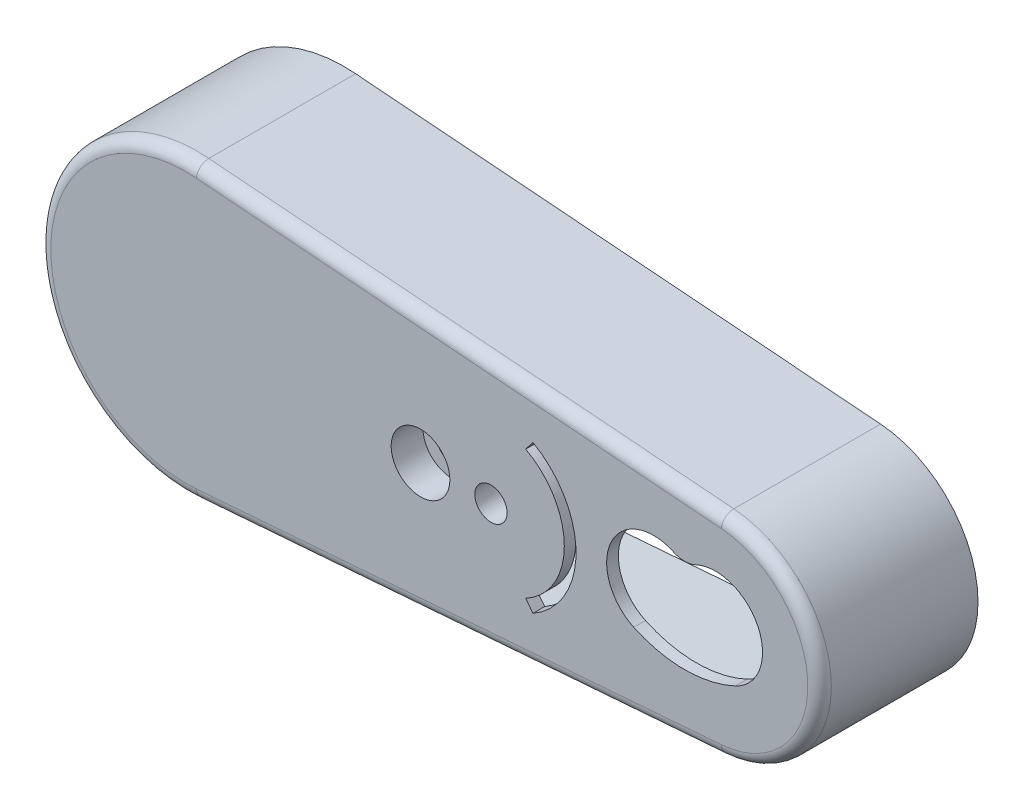
ISO-10303-21;
HEADER;
FILE_DESCRIPTION(('STEP AP214'),'2;1');
FILE_NAME('part.step','',(''),(''),'','','');
FILE_SCHEMA(('AUTOMOTIVE_DESIGN { 1 0 10303 214 1 1 1 1 }'));
ENDSEC;
DATA;
#1=APPLICATION_CONTEXT('core data for automotive mechanical design processes');
#2=APPLICATION_PROTOCOL_DEFINITION('international standard','automotive_design',2000,#1);
#3=PRODUCT_CONTEXT('',#1,'mechanical');
#4=PRODUCT('Part','Part','',(#3));
#5=PRODUCT_RELATED_PRODUCT_CATEGORY('part','',(#4));
#6=PRODUCT_DEFINITION_FORMATION('','',#4);
#7=PRODUCT_DEFINITION_CONTEXT('part definition',#1,'design');
#8=PRODUCT_DEFINITION('design','',#6,#7);
#9=PRODUCT_DEFINITION_SHAPE('','',#8);
#10=(LENGTH_UNIT() NAMED_UNIT(*) SI_UNIT(.MILLI.,.METRE.));
#11=(NAMED_UNIT(*) PLANE_ANGLE_UNIT() SI_UNIT($,.RADIAN.));
#12=(NAMED_UNIT(*) SI_UNIT($,.STERADIAN.) SOLID_ANGLE_UNIT());
#13=UNCERTAINTY_MEASURE_WITH_UNIT(LENGTH_MEASURE(1.E-05),#10,'distance_accuracy_value','');
#14=(GEOMETRIC_REPRESENTATION_CONTEXT(3) GLOBAL_UNCERTAINTY_ASSIGNED_CONTEXT((#13)) GLOBAL_UNIT_ASSIGNED_CONTEXT((#10,
#11,#12)) REPRESENTATION_CONTEXT('',''));
#15=CARTESIAN_POINT('',(0.,0.,0.));
#16=DIRECTION('',(0.,0.,1.));
#17=DIRECTION('',(1.,0.,0.));
#18=AXIS2_PLACEMENT_3D('',#15,#16,#17);
#19=CARTESIAN_POINT('',(0.,0.,25.));
#20=DIRECTION('',(0.,0.,1.));
#21=DIRECTION('',(1.,0.,0.));
#22=AXIS2_PLACEMENT_3D('',#19,#20,#21);
#23=PLANE('',#22);
#24=CARTESIAN_POINT('',(52.,0.,25.));
#25=DIRECTION('',(0.,0.,1.));
#26=DIRECTION('',(1.,0.,0.));
#27=AXIS2_PLACEMENT_3D('',#24,#25,#26);
#28=CIRCLE('',#27,12.5);
#29=CARTESIAN_POINT('',(57.9247778725247,-11.0066801153318,25.));
#30=VERTEX_POINT('',#29);
#31=CARTESIAN_POINT('',(57.9247778725249,11.0066801153318,25.));
#32=VERTEX_POINT('',#31);
#33=EDGE_CURVE('E243',#30,#32,#28,.T.);
#34=ORIENTED_EDGE('',*,*,#33,.F.);
#35=DIRECTION('',(-0.608761429008709,0.793353340291244,0.));
#36=VECTOR('',#35,1.);
#37=CARTESIAN_POINT('',(59.1559637337588,-12.6111927683756,25.));
#38=LINE('',#37,#36);
#39=CARTESIAN_POINT('',(59.1559637337588,-12.6111927683756,25.));
#40=VERTEX_POINT('',#39);
#41=EDGE_CURVE('E225',#40,#30,#38,.T.);
#42=ORIENTED_EDGE('',*,*,#41,.F.);
#43=CARTESIAN_POINT('',(52.,0.,25.));
#44=DIRECTION('',(0.,0.,1.));
#45=DIRECTION('',(1.,0.,0.));
#46=AXIS2_PLACEMENT_3D('',#43,#44,#45);
#47=CIRCLE('',#46,14.5);
#48=CARTESIAN_POINT('',(59.155963733759,12.6111927683754,25.));
#49=VERTEX_POINT('',#48);
#50=EDGE_CURVE('E231',#49,#40,#47,.F.);
#51=ORIENTED_EDGE('',*,*,#50,.F.);
#52=DIRECTION('',(0.608761429008719,0.793353340291236,0.));
#53=VECTOR('',#52,1.);
#54=CARTESIAN_POINT('',(57.9247778725249,11.0066801153318,25.));
#55=LINE('',#54,#53);
#56=EDGE_CURVE('E62',#32,#49,#55,.T.);
#57=ORIENTED_EDGE('',*,*,#56,.F.);
#58=EDGE_LOOP('',(#34,#42,#51,#57));
#59=FACE_BOUND('',#58,.T.);
#60=DIRECTION('',(-1.,0.,0.));
#61=VECTOR('',#60,1.);
#62=CARTESIAN_POINT('',(40.,-6.,25.));
#63=LINE('',#62,#61);
#64=CARTESIAN_POINT('',(52.,-6.,25.));
#65=VERTEX_POINT('',#64);
#66=CARTESIAN_POINT('',(40.,-6.,25.));
#67=VERTEX_POINT('',#66);
#68=EDGE_CURVE('E303',#65,#67,#63,.T.);
#69=ORIENTED_EDGE('',*,*,#68,.F.);
#70=CARTESIAN_POINT('',(52.,0.,25.));
#71=DIRECTION('',(0.,0.,1.));
#72=DIRECTION('',(1.,0.,0.));
#73=AXIS2_PLACEMENT_3D('',#70,#71,#72);
#74=CIRCLE('',#73,6.);
#75=CARTESIAN_POINT('',(52.,6.,25.));
#76=VERTEX_POINT('',#75);
#77=EDGE_CURVE('E294',#76,#65,#74,.F.);
#78=ORIENTED_EDGE('',*,*,#77,.F.);
#79=DIRECTION('',(-1.,0.,0.));
#80=VECTOR('',#79,1.);
#81=CARTESIAN_POINT('',(40.,6.,25.));
#82=LINE('',#81,#80);
#83=CARTESIAN_POINT('',(40.,6.,25.));
#84=VERTEX_POINT('',#83);
#85=EDGE_CURVE('E318',#76,#84,#82,.T.);
#86=ORIENTED_EDGE('',*,*,#85,.T.);
#87=CARTESIAN_POINT('',(40.,0.,25.));
#88=DIRECTION('',(0.,0.,1.));
#89=DIRECTION('',(1.,0.,0.));
#90=AXIS2_PLACEMENT_3D('',#87,#88,#89);
#91=CIRCLE('',#90,6.);
#92=EDGE_CURVE('E314',#84,#67,#91,.T.);
#93=ORIENTED_EDGE('',*,*,#92,.T.);
#94=EDGE_LOOP('',(#69,#78,#86,#93));
#95=FACE_BOUND('',#94,.T.);
#96=CARTESIAN_POINT('',(90.,0.,25.));
#97=DIRECTION('',(0.,0.,1.));
#98=DIRECTION('',(1.,0.,0.));
#99=AXIS2_PLACEMENT_3D('',#96,#97,#98);
#100=CIRCLE('',#99,14.5);
#101=CARTESIAN_POINT('',(91.1277777777778,14.4560754454295,25.));
#102=VERTEX_POINT('',#101);
#103=CARTESIAN_POINT('',(91.1277777777778,-14.4560754454295,25.));
#104=VERTEX_POINT('',#103);
#105=EDGE_CURVE('E446',#102,#104,#100,.F.);
#106=ORIENTED_EDGE('',*,*,#105,.T.);
#107=DIRECTION('',(0.996970720374451,0.0777777777777779,0.));
#108=VECTOR('',#107,1.);
#109=CARTESIAN_POINT('',(91.1277777777778,-14.4560754454295,25.));
#110=LINE('',#109,#108);
#111=CARTESIAN_POINT('',(1.67222222222222,-21.4348704880507,25.));
#112=VERTEX_POINT('',#111);
#113=EDGE_CURVE('E386',#112,#104,#110,.T.);
#114=ORIENTED_EDGE('',*,*,#113,.F.);
#115=CARTESIAN_POINT('',(0.,0.,25.));
#116=DIRECTION('',(0.,0.,1.));
#117=DIRECTION('',(1.,0.,0.));
#118=AXIS2_PLACEMENT_3D('',#115,#116,#117);
#119=CIRCLE('',#118,21.5);
#120=CARTESIAN_POINT('',(1.67222222222222,21.4348704880507,25.));
#121=VERTEX_POINT('',#120);
#122=EDGE_CURVE('E449',#112,#121,#119,.F.);
#123=ORIENTED_EDGE('',*,*,#122,.T.);
#124=DIRECTION('',(0.996970720374451,-0.0777777777777779,0.));
#125=VECTOR('',#124,1.);
#126=CARTESIAN_POINT('',(91.1277777777778,14.4560754454295,25.));
#127=LINE('',#126,#125);
#128=EDGE_CURVE('E444',#121,#102,#127,.T.);
#129=ORIENTED_EDGE('',*,*,#128,.T.);
#130=EDGE_LOOP('',(#106,#114,#123,#129));
#131=FACE_BOUND('',#130,.T.);
#132=CARTESIAN_POINT('',(79.7172717282413,1.17115266204186,25.));
#133=DIRECTION('',(0.,0.,1.));
#134=DIRECTION('',(1.,0.,0.));
#135=AXIS2_PLACEMENT_3D('',#132,#133,#134);
#136=CIRCLE('',#135,8.);
#137=CARTESIAN_POINT('',(83.0982178221669,8.42161495833507,25.));
#138=VERTEX_POINT('',#137);
#139=CARTESIAN_POINT('',(76.3363256343157,-6.07930963425135,25.));
#140=VERTEX_POINT('',#139);
#141=EDGE_CURVE('E320',#138,#140,#136,.T.);
#142=ORIENTED_EDGE('',*,*,#141,.T.);
#143=CARTESIAN_POINT('',(85.,12.5,25.));
#144=DIRECTION('',(0.,0.,1.));
#145=DIRECTION('',(1.,0.,0.));
#146=AXIS2_PLACEMENT_3D('',#143,#144,#145);
#147=CIRCLE('',#146,20.5);
#148=CARTESIAN_POINT('',(93.6636743656843,-6.07930963425135,25.));
#149=VERTEX_POINT('',#148);
#150=EDGE_CURVE('E340',#149,#140,#147,.F.);
#151=ORIENTED_EDGE('',*,*,#150,.F.);
#152=CARTESIAN_POINT('',(90.2827282717587,1.17115266204186,25.));
#153=DIRECTION('',(0.,0.,1.));
#154=DIRECTION('',(1.,0.,0.));
#155=AXIS2_PLACEMENT_3D('',#152,#153,#154);
#156=CIRCLE('',#155,8.);
#157=CARTESIAN_POINT('',(86.9017821778331,8.42161495833507,25.));
#158=VERTEX_POINT('',#157);
#159=EDGE_CURVE('E355',#158,#149,#156,.F.);
#160=ORIENTED_EDGE('',*,*,#159,.F.);
#161=CARTESIAN_POINT('',(85.,12.5,25.));
#162=DIRECTION('',(0.,0.,1.));
#163=DIRECTION('',(1.,0.,0.));
#164=AXIS2_PLACEMENT_3D('',#161,#162,#163);
#165=CIRCLE('',#164,4.5);
#166=EDGE_CURVE('E336',#138,#158,#165,.T.);
#167=ORIENTED_EDGE('',*,*,#166,.F.);
#168=EDGE_LOOP('',(#142,#151,#160,#167));
#169=FACE_BOUND('',#168,.T.);
#170=ADVANCED_FACE('F45',(#59,#95,#131,#169),#23,.F.);
#171=CARTESIAN_POINT('',(0.,0.,27.));
#172=DIRECTION('',(0.,0.,1.));
#173=DIRECTION('',(1.,0.,0.));
#174=AXIS2_PLACEMENT_3D('',#171,#172,#173);
#175=PLANE('',#174);
#176=DIRECTION('',(0.608761429008709,-0.793353340291244,0.));
#177=VECTOR('',#176,1.);
#178=CARTESIAN_POINT('',(59.1559637337588,-12.6111927683756,27.));
#179=LINE('',#178,#177);
#180=CARTESIAN_POINT('',(57.9247778725247,-11.0066801153318,27.));
#181=VERTEX_POINT('',#180);
#182=CARTESIAN_POINT('',(59.1559637337588,-12.6111927683756,27.));
#183=VERTEX_POINT('',#182);
#184=EDGE_CURVE('E73',#181,#183,#179,.T.);
#185=ORIENTED_EDGE('',*,*,#184,.F.);
#186=CARTESIAN_POINT('',(52.,0.,27.));
#187=DIRECTION('',(0.,0.,-1.));
#188=DIRECTION('',(1.,0.,0.));
#189=AXIS2_PLACEMENT_3D('',#186,#187,#188);
#190=CIRCLE('',#189,12.5);
#191=CARTESIAN_POINT('',(57.9247778725249,11.0066801153318,27.));
#192=VERTEX_POINT('',#191);
#193=EDGE_CURVE('E256',#192,#181,#190,.T.);
#194=ORIENTED_EDGE('',*,*,#193,.F.);
#195=DIRECTION('',(-0.60876142900872,-0.793353340291236,0.));
#196=VECTOR('',#195,1.);
#197=CARTESIAN_POINT('',(57.9247778725249,11.0066801153318,27.));
#198=LINE('',#197,#196);
#199=CARTESIAN_POINT('',(59.155963733759,12.6111927683754,27.));
#200=VERTEX_POINT('',#199);
#201=EDGE_CURVE('E248',#200,#192,#198,.T.);
#202=ORIENTED_EDGE('',*,*,#201,.F.);
#203=CARTESIAN_POINT('',(52.,0.,27.));
#204=DIRECTION('',(0.,0.,1.));
#205=DIRECTION('',(1.,0.,0.));
#206=AXIS2_PLACEMENT_3D('',#203,#204,#205);
#207=CIRCLE('',#206,14.5);
#208=EDGE_CURVE('E245',#183,#200,#207,.T.);
#209=ORIENTED_EDGE('',*,*,#208,.F.);
#210=EDGE_LOOP('',(#185,#194,#202,#209));
#211=FACE_BOUND('',#210,.T.);
#212=CARTESIAN_POINT('',(52.,0.,27.));
#213=DIRECTION('',(0.,0.,1.));
#214=DIRECTION('',(1.,0.,0.));
#215=AXIS2_PLACEMENT_3D('',#212,#213,#214);
#216=CIRCLE('',#215,2.75);
#217=CARTESIAN_POINT('',(54.75,0.,27.));
#218=VERTEX_POINT('',#217);
#219=EDGE_CURVE('E239',#218,#218,#216,.T.);
#220=ORIENTED_EDGE('',*,*,#219,.F.);
#221=EDGE_LOOP('',(#220));
#222=FACE_BOUND('',#221,.T.);
#223=CARTESIAN_POINT('',(40.,0.,27.));
#224=DIRECTION('',(0.,0.,1.));
#225=DIRECTION('',(1.,0.,0.));
#226=AXIS2_PLACEMENT_3D('',#223,#224,#225);
#227=CIRCLE('',#226,4.99999999999999);
#228=CARTESIAN_POINT('',(45.,0.,27.));
#229=VERTEX_POINT('',#228);
#230=EDGE_CURVE('E273',#229,#229,#227,.T.);
#231=ORIENTED_EDGE('',*,*,#230,.F.);
#232=EDGE_LOOP('',(#231));
#233=FACE_BOUND('',#232,.T.);
#234=CARTESIAN_POINT('',(0.,0.,27.));
#235=DIRECTION('',(0.,0.,1.));
#236=DIRECTION('',(1.,0.,0.));
#237=AXIS2_PLACEMENT_3D('',#234,#235,#236);
#238=CIRCLE('',#237,23.);
#239=CARTESIAN_POINT('',(1.78888888888889,22.9303265686124,27.));
#240=VERTEX_POINT('',#239);
#241=CARTESIAN_POINT('',(1.78888888888889,-22.9303265686124,27.));
#242=VERTEX_POINT('',#241);
#243=EDGE_CURVE('E460',#240,#242,#238,.T.);
#244=ORIENTED_EDGE('',*,*,#243,.T.);
#245=DIRECTION('',(-0.996970720374451,-0.0777777777777778,0.));
#246=VECTOR('',#245,1.);
#247=CARTESIAN_POINT('',(1.78888888888889,-22.9303265686124,27.));
#248=LINE('',#247,#246);
#249=CARTESIAN_POINT('',(91.2444444444445,-15.9515315259912,27.));
#250=VERTEX_POINT('',#249);
#251=EDGE_CURVE('E390',#250,#242,#248,.T.);
#252=ORIENTED_EDGE('',*,*,#251,.F.);
#253=CARTESIAN_POINT('',(90.,0.,27.));
#254=DIRECTION('',(0.,0.,1.));
#255=DIRECTION('',(1.,0.,0.));
#256=AXIS2_PLACEMENT_3D('',#253,#254,#255);
#257=CIRCLE('',#256,16.);
#258=CARTESIAN_POINT('',(91.2444444444445,15.9515315259912,27.));
#259=VERTEX_POINT('',#258);
#260=EDGE_CURVE('E463',#250,#259,#257,.T.);
#261=ORIENTED_EDGE('',*,*,#260,.T.);
#262=DIRECTION('',(-0.996970720374451,0.0777777777777778,0.));
#263=VECTOR('',#262,1.);
#264=CARTESIAN_POINT('',(1.78888888888889,22.9303265686124,27.));
#265=LINE('',#264,#263);
#266=EDGE_CURVE('E458',#259,#240,#265,.T.);
#267=ORIENTED_EDGE('',*,*,#266,.T.);
#268=EDGE_LOOP('',(#244,#252,#261,#267));
#269=FACE_BOUND('',#268,.T.);
#270=CARTESIAN_POINT('',(85.,12.5,27.));
#271=DIRECTION('',(0.,0.,1.));
#272=DIRECTION('',(1.,0.,0.));
#273=AXIS2_PLACEMENT_3D('',#270,#271,#272);
#274=CIRCLE('',#273,20.5);
#275=CARTESIAN_POINT('',(76.3363256343157,-6.07930963425135,27.));
#276=VERTEX_POINT('',#275);
#277=CARTESIAN_POINT('',(93.6636743656843,-6.07930963425135,27.));
#278=VERTEX_POINT('',#277);
#279=EDGE_CURVE('E343',#276,#278,#274,.T.);
#280=ORIENTED_EDGE('',*,*,#279,.F.);
#281=CARTESIAN_POINT('',(79.7172717282413,1.17115266204186,27.));
#282=DIRECTION('',(0.,0.,-1.));
#283=DIRECTION('',(-1.,0.,0.));
#284=AXIS2_PLACEMENT_3D('',#281,#282,#283);
#285=CIRCLE('',#284,8.);
#286=CARTESIAN_POINT('',(83.0982178221669,8.42161495833507,27.));
#287=VERTEX_POINT('',#286);
#288=EDGE_CURVE('E327',#276,#287,#285,.T.);
#289=ORIENTED_EDGE('',*,*,#288,.T.);
#290=CARTESIAN_POINT('',(85.,12.5,27.));
#291=DIRECTION('',(0.,0.,-1.));
#292=DIRECTION('',(1.,0.,0.));
#293=AXIS2_PLACEMENT_3D('',#290,#291,#292);
#294=CIRCLE('',#293,4.5);
#295=CARTESIAN_POINT('',(86.9017821778331,8.42161495833507,27.));
#296=VERTEX_POINT('',#295);
#297=EDGE_CURVE('E350',#296,#287,#294,.T.);
#298=ORIENTED_EDGE('',*,*,#297,.F.);
#299=CARTESIAN_POINT('',(90.2827282717587,1.17115266204186,27.));
#300=DIRECTION('',(0.,0.,1.));
#301=DIRECTION('',(1.,0.,0.));
#302=AXIS2_PLACEMENT_3D('',#299,#300,#301);
#303=CIRCLE('',#302,8.);
#304=EDGE_CURVE('E346',#278,#296,#303,.T.);
#305=ORIENTED_EDGE('',*,*,#304,.F.);
#306=EDGE_LOOP('',(#280,#289,#298,#305));
#307=FACE_BOUND('',#306,.T.);
#308=ADVANCED_FACE('F490',(#211,#222,#233,#269,#307),#175,.T.);
#309=CARTESIAN_POINT('',(90.,0.,25.));
#310=DIRECTION('',(0.,0.,-1.));
#311=DIRECTION('',(-1.,0.,0.));
#312=AXIS2_PLACEMENT_3D('',#309,#310,#311);
#313=CYLINDRICAL_SURFACE('',#312,18.);
#314=DIRECTION('',(0.,0.,-1.));
#315=VECTOR('',#314,1.);
#316=CARTESIAN_POINT('',(91.4,17.9454729667401,25.));
#317=LINE('',#316,#315);
#318=CARTESIAN_POINT('',(91.4,17.9454729667401,25.));
#319=VERTEX_POINT('',#318);
#320=CARTESIAN_POINT('',(91.4,17.9454729667401,0.));
#321=VERTEX_POINT('',#320);
#322=EDGE_CURVE('E442',#319,#321,#317,.T.);
#323=ORIENTED_EDGE('',*,*,#322,.F.);
#324=CARTESIAN_POINT('',(90.,0.,25.));
#325=DIRECTION('',(0.,0.,1.));
#326=DIRECTION('',(1.,0.,0.));
#327=AXIS2_PLACEMENT_3D('',#324,#325,#326);
#328=CIRCLE('',#327,18.);
#329=CARTESIAN_POINT('',(91.4,-17.9454729667401,25.));
#330=VERTEX_POINT('',#329);
#331=EDGE_CURVE('E467',#319,#330,#328,.F.);
#332=ORIENTED_EDGE('',*,*,#331,.T.);
#333=DIRECTION('',(0.,0.,-1.));
#334=VECTOR('',#333,1.);
#335=CARTESIAN_POINT('',(91.4,-17.9454729667401,25.));
#336=LINE('',#335,#334);
#337=CARTESIAN_POINT('',(91.4,-17.9454729667401,0.));
#338=VERTEX_POINT('',#337);
#339=EDGE_CURVE('E382',#330,#338,#336,.T.);
#340=ORIENTED_EDGE('',*,*,#339,.T.);
#341=CARTESIAN_POINT('',(90.,0.,0.));
#342=DIRECTION('',(0.,0.,1.));
#343=DIRECTION('',(1.,0.,0.));
#344=AXIS2_PLACEMENT_3D('',#341,#342,#343);
#345=CIRCLE('',#344,18.);
#346=EDGE_CURVE('E415',#338,#321,#345,.T.);
#347=ORIENTED_EDGE('',*,*,#346,.T.);
#348=EDGE_LOOP('',(#323,#332,#340,#347));
#349=FACE_BOUND('',#348,.T.);
#350=ADVANCED_FACE('F504',(#349),#313,.T.);
#351=CARTESIAN_POINT('',(1.94444444444445,24.9242680093613,25.));
#352=DIRECTION('',(-0.0777777777777778,-0.99697072037445,0.));
#353=DIRECTION('',(0.996970720374451,-0.0777777777777778,0.));
#354=AXIS2_PLACEMENT_3D('',#351,#352,#353);
#355=PLANE('',#354);
#356=DIRECTION('',(0.,0.,-1.));
#357=VECTOR('',#356,1.);
#358=CARTESIAN_POINT('',(1.94444444444444,24.9242680093613,25.));
#359=LINE('',#358,#357);
#360=CARTESIAN_POINT('',(1.94444444444444,24.9242680093613,25.));
#361=VERTEX_POINT('',#360);
#362=CARTESIAN_POINT('',(1.94444444444444,24.9242680093613,0.));
#363=VERTEX_POINT('',#362);
#364=EDGE_CURVE('E440',#361,#363,#359,.T.);
#365=ORIENTED_EDGE('',*,*,#364,.F.);
#366=DIRECTION('',(-0.996970720374451,0.0777777777777778,0.));
#367=VECTOR('',#366,1.);
#368=CARTESIAN_POINT('',(91.4,17.9454729667401,25.));
#369=LINE('',#368,#367);
#370=EDGE_CURVE('E11',#361,#319,#369,.F.);
#371=ORIENTED_EDGE('',*,*,#370,.T.);
#372=ORIENTED_EDGE('',*,*,#322,.T.);
#373=DIRECTION('',(-0.99697072037445,0.0777777777777778,0.));
#374=VECTOR('',#373,1.);
#375=CARTESIAN_POINT('',(1.94444444444445,24.9242680093613,0.));
#376=LINE('',#375,#374);
#377=EDGE_CURVE('E419',#321,#363,#376,.T.);
#378=ORIENTED_EDGE('',*,*,#377,.T.);
#379=EDGE_LOOP('',(#365,#371,#372,#378));
#380=FACE_BOUND('',#379,.T.);
#381=ADVANCED_FACE('F508',(#380),#355,.F.);
#382=CARTESIAN_POINT('',(0.,0.,25.));
#383=DIRECTION('',(0.,0.,-1.));
#384=DIRECTION('',(-1.,0.,0.));
#385=AXIS2_PLACEMENT_3D('',#382,#383,#384);
#386=CYLINDRICAL_SURFACE('',#385,25.);
#387=CARTESIAN_POINT('',(0.,0.,0.));
#388=DIRECTION('',(0.,0.,1.));
#389=DIRECTION('',(1.,0.,0.));
#390=AXIS2_PLACEMENT_3D('',#387,#388,#389);
#391=CIRCLE('',#390,25.);
#392=CARTESIAN_POINT('',(1.94444444444444,-24.9242680093613,0.));
#393=VERTEX_POINT('',#392);
#394=EDGE_CURVE('E423',#363,#393,#391,.T.);
#395=ORIENTED_EDGE('',*,*,#394,.T.);
#396=DIRECTION('',(0.,0.,-1.));
#397=VECTOR('',#396,1.);
#398=CARTESIAN_POINT('',(1.94444444444444,-24.9242680093613,25.));
#399=LINE('',#398,#397);
#400=CARTESIAN_POINT('',(1.94444444444444,-24.9242680093613,25.));
#401=VERTEX_POINT('',#400);
#402=EDGE_CURVE('E379',#401,#393,#399,.T.);
#403=ORIENTED_EDGE('',*,*,#402,.F.);
#404=CARTESIAN_POINT('',(0.,0.,25.));
#405=DIRECTION('',(0.,0.,1.));
#406=DIRECTION('',(1.,0.,0.));
#407=AXIS2_PLACEMENT_3D('',#404,#405,#406);
#408=CIRCLE('',#407,25.);
#409=EDGE_CURVE('E470',#401,#361,#408,.F.);
#410=ORIENTED_EDGE('',*,*,#409,.T.);
#411=ORIENTED_EDGE('',*,*,#364,.T.);
#412=EDGE_LOOP('',(#395,#403,#410,#411));
#413=FACE_BOUND('',#412,.T.);
#414=ADVANCED_FACE('F513',(#413),#386,.T.);
#415=CARTESIAN_POINT('',(0.,0.,25.));
#416=DIRECTION('',(0.,0.,-1.));
#417=DIRECTION('',(-1.,0.,0.));
#418=AXIS2_PLACEMENT_3D('',#415,#416,#417);
#419=CYLINDRICAL_SURFACE('',#418,23.5);
#420=DIRECTION('',(0.,0.,-1.));
#421=VECTOR('',#420,1.);
#422=CARTESIAN_POINT('',(1.82777777777778,23.4288119287996,25.));
#423=LINE('',#422,#421);
#424=CARTESIAN_POINT('',(1.82777777777778,23.4288119287996,23.));
#425=VERTEX_POINT('',#424);
#426=CARTESIAN_POINT('',(1.82777777777778,23.4288119287996,0.));
#427=VERTEX_POINT('',#426);
#428=EDGE_CURVE('E438',#425,#427,#423,.T.);
#429=ORIENTED_EDGE('',*,*,#428,.F.);
#430=CARTESIAN_POINT('',(0.,0.,23.));
#431=DIRECTION('',(0.,0.,1.));
#432=DIRECTION('',(1.,0.,0.));
#433=AXIS2_PLACEMENT_3D('',#430,#431,#432);
#434=CIRCLE('',#433,23.5);
#435=CARTESIAN_POINT('',(1.82777777777778,-23.4288119287996,23.));
#436=VERTEX_POINT('',#435);
#437=EDGE_CURVE('E453',#425,#436,#434,.T.);
#438=ORIENTED_EDGE('',*,*,#437,.T.);
#439=DIRECTION('',(0.,0.,-1.));
#440=VECTOR('',#439,1.);
#441=CARTESIAN_POINT('',(1.82777777777778,-23.4288119287996,25.));
#442=LINE('',#441,#440);
#443=CARTESIAN_POINT('',(1.82777777777778,-23.4288119287996,0.));
#444=VERTEX_POINT('',#443);
#445=EDGE_CURVE('E376',#436,#444,#442,.T.);
#446=ORIENTED_EDGE('',*,*,#445,.T.);
#447=CARTESIAN_POINT('',(0.,0.,0.));
#448=DIRECTION('',(0.,0.,-1.));
#449=DIRECTION('',(1.,0.,0.));
#450=AXIS2_PLACEMENT_3D('',#447,#448,#449);
#451=CIRCLE('',#450,23.5);
#452=EDGE_CURVE('E426',#444,#427,#451,.T.);
#453=ORIENTED_EDGE('',*,*,#452,.T.);
#454=EDGE_LOOP('',(#429,#438,#446,#453));
#455=FACE_BOUND('',#454,.T.);
#456=ADVANCED_FACE('F515',(#455),#419,.F.);
#457=CARTESIAN_POINT('',(1.82777777777778,23.4288119287996,25.));
#458=DIRECTION('',(0.0777777777777779,0.99697072037445,0.));
#459=DIRECTION('',(-0.996970720374451,0.0777777777777779,0.));
#460=AXIS2_PLACEMENT_3D('',#457,#458,#459);
#461=PLANE('',#460);
#462=DIRECTION('',(0.,0.,-1.));
#463=VECTOR('',#462,1.);
#464=CARTESIAN_POINT('',(91.2833333333333,16.4500168861784,25.));
#465=LINE('',#464,#463);
#466=CARTESIAN_POINT('',(91.2833333333333,16.4500168861784,23.));
#467=VERTEX_POINT('',#466);
#468=CARTESIAN_POINT('',(91.2833333333333,16.4500168861784,0.));
#469=VERTEX_POINT('',#468);
#470=EDGE_CURVE('E436',#467,#469,#465,.T.);
#471=ORIENTED_EDGE('',*,*,#470,.F.);
#472=DIRECTION('',(0.996970720374451,-0.0777777777777779,0.));
#473=VECTOR('',#472,1.);
#474=CARTESIAN_POINT('',(1.82777777777778,23.4288119287996,23.));
#475=LINE('',#474,#473);
#476=EDGE_CURVE('E54',#467,#425,#475,.F.);
#477=ORIENTED_EDGE('',*,*,#476,.T.);
#478=ORIENTED_EDGE('',*,*,#428,.T.);
#479=DIRECTION('',(0.99697072037445,-0.0777777777777779,0.));
#480=VECTOR('',#479,1.);
#481=CARTESIAN_POINT('',(1.82777777777778,23.4288119287996,0.));
#482=LINE('',#481,#480);
#483=EDGE_CURVE('E430',#427,#469,#482,.T.);
#484=ORIENTED_EDGE('',*,*,#483,.T.);
#485=EDGE_LOOP('',(#471,#477,#478,#484));
#486=FACE_BOUND('',#485,.T.);
#487=ADVANCED_FACE('F520',(#486),#461,.F.);
#488=CARTESIAN_POINT('',(90.,0.,25.));
#489=DIRECTION('',(0.,0.,-1.));
#490=DIRECTION('',(-1.,0.,0.));
#491=AXIS2_PLACEMENT_3D('',#488,#489,#490);
#492=CYLINDRICAL_SURFACE('',#491,16.5);
#493=CARTESIAN_POINT('',(90.,0.,0.));
#494=DIRECTION('',(0.,0.,-1.));
#495=DIRECTION('',(1.,0.,0.));
#496=AXIS2_PLACEMENT_3D('',#493,#494,#495);
#497=CIRCLE('',#496,16.5);
#498=CARTESIAN_POINT('',(91.2833333333333,-16.4500168861784,0.));
#499=VERTEX_POINT('',#498);
#500=EDGE_CURVE('E433',#469,#499,#497,.T.);
#501=ORIENTED_EDGE('',*,*,#500,.T.);
#502=DIRECTION('',(0.,0.,-1.));
#503=VECTOR('',#502,1.);
#504=CARTESIAN_POINT('',(91.2833333333333,-16.4500168861784,25.));
#505=LINE('',#504,#503);
#506=CARTESIAN_POINT('',(91.2833333333333,-16.4500168861784,23.));
#507=VERTEX_POINT('',#506);
#508=EDGE_CURVE('E372',#507,#499,#505,.T.);
#509=ORIENTED_EDGE('',*,*,#508,.F.);
#510=CARTESIAN_POINT('',(90.,0.,23.));
#511=DIRECTION('',(0.,0.,1.));
#512=DIRECTION('',(1.,0.,0.));
#513=AXIS2_PLACEMENT_3D('',#510,#511,#512);
#514=CIRCLE('',#513,16.5);
#515=EDGE_CURVE('E455',#507,#467,#514,.T.);
#516=ORIENTED_EDGE('',*,*,#515,.T.);
#517=ORIENTED_EDGE('',*,*,#470,.T.);
#518=EDGE_LOOP('',(#501,#509,#516,#517));
#519=FACE_BOUND('',#518,.T.);
#520=ADVANCED_FACE('F536',(#519),#492,.F.);
#521=CARTESIAN_POINT('',(90.,0.,0.));
#522=DIRECTION('',(0.,0.,1.));
#523=DIRECTION('',(1.,0.,0.));
#524=AXIS2_PLACEMENT_3D('',#521,#522,#523);
#525=PLANE('',#524);
#526=ORIENTED_EDGE('',*,*,#452,.F.);
#527=DIRECTION('',(0.99697072037445,0.0777777777777779,0.));
#528=VECTOR('',#527,1.);
#529=CARTESIAN_POINT('',(1.82777777777778,-23.4288119287996,0.));
#530=LINE('',#529,#528);
#531=EDGE_CURVE('E367',#444,#499,#530,.T.);
#532=ORIENTED_EDGE('',*,*,#531,.T.);
#533=ORIENTED_EDGE('',*,*,#500,.F.);
#534=ORIENTED_EDGE('',*,*,#483,.F.);
#535=EDGE_LOOP('',(#526,#532,#533,#534));
#536=FACE_BOUND('',#535,.T.);
#537=ORIENTED_EDGE('',*,*,#346,.F.);
#538=DIRECTION('',(-0.99697072037445,-0.0777777777777778,0.));
#539=VECTOR('',#538,1.);
#540=CARTESIAN_POINT('',(1.94444444444445,-24.9242680093613,0.));
#541=LINE('',#540,#539);
#542=EDGE_CURVE('E363',#338,#393,#541,.T.);
#543=ORIENTED_EDGE('',*,*,#542,.T.);
#544=ORIENTED_EDGE('',*,*,#394,.F.);
#545=ORIENTED_EDGE('',*,*,#377,.F.);
#546=EDGE_LOOP('',(#537,#543,#544,#545));
#547=FACE_BOUND('',#546,.T.);
#548=ADVANCED_FACE('F511',(#536,#547),#525,.F.);
#549=CARTESIAN_POINT('',(90.,0.,23.));
#550=DIRECTION('',(0.,0.,1.));
#551=DIRECTION('',(1.,0.,0.));
#552=AXIS2_PLACEMENT_3D('',#549,#550,#551);
#553=TOROIDAL_SURFACE('',#552,14.5,2.);
#554=ORIENTED_EDGE('',*,*,#515,.F.);
#555=CARTESIAN_POINT('',(91.1277777777778,-14.4560754454295,23.));
#556=DIRECTION('',(-0.99697072037445,-0.0777777777777807,0.));
#557=DIRECTION('',(0.0777777777777807,-0.99697072037445,0.));
#558=AXIS2_PLACEMENT_3D('',#555,#556,#557);
#559=CIRCLE('',#558,2.);
#560=EDGE_CURVE('E368',#507,#104,#559,.T.);
#561=ORIENTED_EDGE('',*,*,#560,.T.);
#562=ORIENTED_EDGE('',*,*,#105,.F.);
#563=CARTESIAN_POINT('',(91.1277777777778,14.4560754454295,23.));
#564=DIRECTION('',(0.99697072037445,-0.0777777777777807,0.));
#565=DIRECTION('',(0.0777777777777807,0.99697072037445,0.));
#566=AXIS2_PLACEMENT_3D('',#563,#564,#565);
#567=CIRCLE('',#566,2.);
#568=EDGE_CURVE('E420',#467,#102,#567,.T.);
#569=ORIENTED_EDGE('',*,*,#568,.F.);
#570=EDGE_LOOP('',(#554,#561,#562,#569));
#571=FACE_BOUND('',#570,.T.);
#572=ADVANCED_FACE('F535',(#571),#553,.F.);
#573=CARTESIAN_POINT('',(1.67222222222222,21.4348704880507,23.));
#574=DIRECTION('',(-0.996970720374451,0.0777777777777779,0.));
#575=DIRECTION('',(-0.0777777777777779,-0.996970720374451,0.));
#576=AXIS2_PLACEMENT_3D('',#573,#574,#575);
#577=CYLINDRICAL_SURFACE('',#576,2.);
#578=ORIENTED_EDGE('',*,*,#568,.T.);
#579=ORIENTED_EDGE('',*,*,#128,.F.);
#580=CARTESIAN_POINT('',(1.67222222222222,21.4348704880507,23.));
#581=DIRECTION('',(0.99697072037445,-0.0777777777777778,0.));
#582=DIRECTION('',(0.0777777777777778,0.99697072037445,0.));
#583=AXIS2_PLACEMENT_3D('',#580,#581,#582);
#584=CIRCLE('',#583,2.);
#585=EDGE_CURVE('E473',#425,#121,#584,.T.);
#586=ORIENTED_EDGE('',*,*,#585,.F.);
#587=ORIENTED_EDGE('',*,*,#476,.F.);
#588=EDGE_LOOP('',(#578,#579,#586,#587));
#589=FACE_BOUND('',#588,.T.);
#590=ADVANCED_FACE('F559',(#589),#577,.F.);
#591=CARTESIAN_POINT('',(0.,0.,23.));
#592=DIRECTION('',(0.,0.,1.));
#593=DIRECTION('',(1.,0.,0.));
#594=AXIS2_PLACEMENT_3D('',#591,#592,#593);
#595=TOROIDAL_SURFACE('',#594,21.5,2.);
#596=ORIENTED_EDGE('',*,*,#122,.F.);
#597=CARTESIAN_POINT('',(1.67222222222222,-21.4348704880507,23.));
#598=DIRECTION('',(-0.99697072037445,-0.0777777777777778,0.));
#599=DIRECTION('',(0.0777777777777778,-0.99697072037445,0.));
#600=AXIS2_PLACEMENT_3D('',#597,#598,#599);
#601=CIRCLE('',#600,2.);
#602=EDGE_CURVE('E403',#436,#112,#601,.T.);
#603=ORIENTED_EDGE('',*,*,#602,.F.);
#604=ORIENTED_EDGE('',*,*,#437,.F.);
#605=ORIENTED_EDGE('',*,*,#585,.T.);
#606=EDGE_LOOP('',(#596,#603,#604,#605));
#607=FACE_BOUND('',#606,.T.);
#608=ADVANCED_FACE('F562',(#607),#595,.F.);
#609=CARTESIAN_POINT('',(0.,0.,25.));
#610=DIRECTION('',(0.,0.,1.));
#611=DIRECTION('',(1.,0.,0.));
#612=AXIS2_PLACEMENT_3D('',#609,#610,#611);
#613=TOROIDAL_SURFACE('',#612,23.,2.);
#614=ORIENTED_EDGE('',*,*,#409,.F.);
#615=CARTESIAN_POINT('',(1.78888888888889,-22.9303265686124,25.));
#616=DIRECTION('',(-0.99697072037445,-0.0777777777777777,0.));
#617=DIRECTION('',(0.0777777777777777,-0.99697072037445,0.));
#618=AXIS2_PLACEMENT_3D('',#615,#616,#617);
#619=CIRCLE('',#618,2.);
#620=EDGE_CURVE('E406',#401,#242,#619,.T.);
#621=ORIENTED_EDGE('',*,*,#620,.T.);
#622=ORIENTED_EDGE('',*,*,#243,.F.);
#623=CARTESIAN_POINT('',(1.78888888888889,22.9303265686124,25.));
#624=DIRECTION('',(0.99697072037445,-0.0777777777777777,0.));
#625=DIRECTION('',(0.0777777777777777,0.99697072037445,0.));
#626=AXIS2_PLACEMENT_3D('',#623,#624,#625);
#627=CIRCLE('',#626,2.);
#628=EDGE_CURVE('E49',#361,#240,#627,.T.);
#629=ORIENTED_EDGE('',*,*,#628,.F.);
#630=EDGE_LOOP('',(#614,#621,#622,#629));
#631=FACE_BOUND('',#630,.T.);
#632=ADVANCED_FACE('F47',(#631),#613,.T.);
#633=CARTESIAN_POINT('',(1.78888888888889,22.9303265686124,25.));
#634=DIRECTION('',(0.996970720374451,-0.0777777777777778,0.));
#635=DIRECTION('',(0.0777777777777778,0.996970720374451,0.));
#636=AXIS2_PLACEMENT_3D('',#633,#634,#635);
#637=CYLINDRICAL_SURFACE('',#636,2.);
#638=ORIENTED_EDGE('',*,*,#628,.T.);
#639=ORIENTED_EDGE('',*,*,#266,.F.);
#640=CARTESIAN_POINT('',(91.2444444444445,15.9515315259912,25.));
#641=DIRECTION('',(0.99697072037445,-0.0777777777777807,0.));
#642=DIRECTION('',(0.0777777777777807,0.99697072037445,0.));
#643=AXIS2_PLACEMENT_3D('',#640,#641,#642);
#644=CIRCLE('',#643,2.);
#645=EDGE_CURVE('E402',#319,#259,#644,.T.);
#646=ORIENTED_EDGE('',*,*,#645,.F.);
#647=ORIENTED_EDGE('',*,*,#370,.F.);
#648=EDGE_LOOP('',(#638,#639,#646,#647));
#649=FACE_BOUND('',#648,.T.);
#650=ADVANCED_FACE('F484',(#649),#637,.T.);
#651=CARTESIAN_POINT('',(90.,0.,25.));
#652=DIRECTION('',(0.,0.,1.));
#653=DIRECTION('',(1.,0.,0.));
#654=AXIS2_PLACEMENT_3D('',#651,#652,#653);
#655=TOROIDAL_SURFACE('',#654,16.,2.);
#656=ORIENTED_EDGE('',*,*,#260,.F.);
#657=CARTESIAN_POINT('',(91.2444444444445,-15.9515315259912,25.));
#658=DIRECTION('',(-0.99697072037445,-0.0777777777777807,0.));
#659=DIRECTION('',(0.0777777777777807,-0.99697072037445,0.));
#660=AXIS2_PLACEMENT_3D('',#657,#658,#659);
#661=CIRCLE('',#660,2.);
#662=EDGE_CURVE('E362',#330,#250,#661,.T.);
#663=ORIENTED_EDGE('',*,*,#662,.F.);
#664=ORIENTED_EDGE('',*,*,#331,.F.);
#665=ORIENTED_EDGE('',*,*,#645,.T.);
#666=EDGE_LOOP('',(#656,#663,#664,#665));
#667=FACE_BOUND('',#666,.T.);
#668=ADVANCED_FACE('F493',(#667),#655,.T.);
#669=CARTESIAN_POINT('',(1.94444444444445,-24.9242680093613,25.));
#670=DIRECTION('',(-0.0777777777777778,0.99697072037445,0.));
#671=DIRECTION('',(0.996970720374451,0.0777777777777778,0.));
#672=AXIS2_PLACEMENT_3D('',#669,#670,#671);
#673=PLANE('',#672);
#674=ORIENTED_EDGE('',*,*,#402,.T.);
#675=ORIENTED_EDGE('',*,*,#542,.F.);
#676=ORIENTED_EDGE('',*,*,#339,.F.);
#677=DIRECTION('',(-0.996970720374451,-0.0777777777777778,0.));
#678=VECTOR('',#677,1.);
#679=CARTESIAN_POINT('',(91.4,-17.9454729667401,25.));
#680=LINE('',#679,#678);
#681=EDGE_CURVE('E398',#401,#330,#680,.F.);
#682=ORIENTED_EDGE('',*,*,#681,.F.);
#683=EDGE_LOOP('',(#674,#675,#676,#682));
#684=FACE_BOUND('',#683,.T.);
#685=ADVANCED_FACE('F501',(#684),#673,.F.);
#686=CARTESIAN_POINT('',(1.82777777777778,-23.4288119287996,25.));
#687=DIRECTION('',(0.0777777777777779,-0.99697072037445,0.));
#688=DIRECTION('',(-0.996970720374451,-0.0777777777777779,0.));
#689=AXIS2_PLACEMENT_3D('',#686,#687,#688);
#690=PLANE('',#689);
#691=ORIENTED_EDGE('',*,*,#508,.T.);
#692=ORIENTED_EDGE('',*,*,#531,.F.);
#693=ORIENTED_EDGE('',*,*,#445,.F.);
#694=DIRECTION('',(0.996970720374451,0.0777777777777779,0.));
#695=VECTOR('',#694,1.);
#696=CARTESIAN_POINT('',(1.82777777777778,-23.4288119287996,23.));
#697=LINE('',#696,#695);
#698=EDGE_CURVE('E394',#507,#436,#697,.F.);
#699=ORIENTED_EDGE('',*,*,#698,.F.);
#700=EDGE_LOOP('',(#691,#692,#693,#699));
#701=FACE_BOUND('',#700,.T.);
#702=ADVANCED_FACE('F569',(#701),#690,.F.);
#703=CARTESIAN_POINT('',(1.67222222222222,-21.4348704880507,23.));
#704=DIRECTION('',(-0.996970720374451,-0.0777777777777779,0.));
#705=DIRECTION('',(-0.0777777777777779,0.996970720374451,0.));
#706=AXIS2_PLACEMENT_3D('',#703,#704,#705);
#707=CYLINDRICAL_SURFACE('',#706,2.);
#708=ORIENTED_EDGE('',*,*,#560,.F.);
#709=ORIENTED_EDGE('',*,*,#698,.T.);
#710=ORIENTED_EDGE('',*,*,#602,.T.);
#711=ORIENTED_EDGE('',*,*,#113,.T.);
#712=EDGE_LOOP('',(#708,#709,#710,#711));
#713=FACE_BOUND('',#712,.T.);
#714=ADVANCED_FACE('F571',(#713),#707,.F.);
#715=CARTESIAN_POINT('',(1.78888888888889,-22.9303265686124,25.));
#716=DIRECTION('',(0.996970720374451,0.0777777777777778,0.));
#717=DIRECTION('',(0.0777777777777778,-0.996970720374451,0.));
#718=AXIS2_PLACEMENT_3D('',#715,#716,#717);
#719=CYLINDRICAL_SURFACE('',#718,2.);
#720=ORIENTED_EDGE('',*,*,#620,.F.);
#721=ORIENTED_EDGE('',*,*,#681,.T.);
#722=ORIENTED_EDGE('',*,*,#662,.T.);
#723=ORIENTED_EDGE('',*,*,#251,.T.);
#724=EDGE_LOOP('',(#720,#721,#722,#723));
#725=FACE_BOUND('',#724,.T.);
#726=ADVANCED_FACE('F495',(#725),#719,.T.);
#727=CARTESIAN_POINT('',(85.,12.5,-0.001000000000001));
#728=DIRECTION('',(0.,0.,1.));
#729=DIRECTION('',(1.,0.,0.));
#730=AXIS2_PLACEMENT_3D('',#727,#728,#729);
#731=CYLINDRICAL_SURFACE('',#730,20.5);
#732=ORIENTED_EDGE('',*,*,#150,.T.);
#733=DIRECTION('',(0.,0.,1.));
#734=VECTOR('',#733,1.);
#735=CARTESIAN_POINT('',(76.3363256343157,-6.07930963425135,-0.001000000000001));
#736=LINE('',#735,#734);
#737=EDGE_CURVE('E332',#140,#276,#736,.T.);
#738=ORIENTED_EDGE('',*,*,#737,.T.);
#739=ORIENTED_EDGE('',*,*,#279,.T.);
#740=DIRECTION('',(0.,0.,1.));
#741=VECTOR('',#740,1.);
#742=CARTESIAN_POINT('',(93.6636743656843,-6.07930963425135,-0.001000000000001));
#743=LINE('',#742,#741);
#744=EDGE_CURVE('E352',#149,#278,#743,.T.);
#745=ORIENTED_EDGE('',*,*,#744,.F.);
#746=EDGE_LOOP('',(#732,#738,#739,#745));
#747=FACE_BOUND('',#746,.T.);
#748=ADVANCED_FACE('F589',(#747),#731,.F.);
#749=CARTESIAN_POINT('',(85.,12.5,-0.001000000000001));
#750=DIRECTION('',(0.,0.,1.));
#751=DIRECTION('',(1.,0.,0.));
#752=AXIS2_PLACEMENT_3D('',#749,#750,#751);
#753=CYLINDRICAL_SURFACE('',#752,4.5);
#754=ORIENTED_EDGE('',*,*,#166,.T.);
#755=DIRECTION('',(0.,0.,1.));
#756=VECTOR('',#755,1.);
#757=CARTESIAN_POINT('',(86.9017821778331,8.42161495833507,-0.001000000000001));
#758=LINE('',#757,#756);
#759=EDGE_CURVE('E353',#158,#296,#758,.T.);
#760=ORIENTED_EDGE('',*,*,#759,.T.);
#761=ORIENTED_EDGE('',*,*,#297,.T.);
#762=DIRECTION('',(0.,0.,1.));
#763=VECTOR('',#762,1.);
#764=CARTESIAN_POINT('',(83.0982178221669,8.42161495833507,-0.001000000000001));
#765=LINE('',#764,#763);
#766=EDGE_CURVE('E331',#138,#287,#765,.T.);
#767=ORIENTED_EDGE('',*,*,#766,.F.);
#768=EDGE_LOOP('',(#754,#760,#761,#767));
#769=FACE_BOUND('',#768,.T.);
#770=ADVANCED_FACE('F584',(#769),#753,.T.);
#771=CARTESIAN_POINT('',(90.2827282717587,1.17115266204186,-0.001000000000001));
#772=DIRECTION('',(0.,0.,1.));
#773=DIRECTION('',(1.,0.,0.));
#774=AXIS2_PLACEMENT_3D('',#771,#772,#773);
#775=CYLINDRICAL_SURFACE('',#774,8.);
#776=ORIENTED_EDGE('',*,*,#159,.T.);
#777=ORIENTED_EDGE('',*,*,#744,.T.);
#778=ORIENTED_EDGE('',*,*,#304,.T.);
#779=ORIENTED_EDGE('',*,*,#759,.F.);
#780=EDGE_LOOP('',(#776,#777,#778,#779));
#781=FACE_BOUND('',#780,.T.);
#782=ADVANCED_FACE('F591',(#781),#775,.F.);
#783=CARTESIAN_POINT('',(79.7172717282413,1.17115266204186,-0.001000000000001));
#784=DIRECTION('',(0.,0.,1.));
#785=DIRECTION('',(1.,0.,0.));
#786=AXIS2_PLACEMENT_3D('',#783,#784,#785);
#787=CYLINDRICAL_SURFACE('',#786,8.);
#788=ORIENTED_EDGE('',*,*,#766,.T.);
#789=ORIENTED_EDGE('',*,*,#288,.F.);
#790=ORIENTED_EDGE('',*,*,#737,.F.);
#791=ORIENTED_EDGE('',*,*,#141,.F.);
#792=EDGE_LOOP('',(#788,#789,#790,#791));
#793=FACE_BOUND('',#792,.T.);
#794=ADVANCED_FACE('F581',(#793),#787,.F.);
#795=CARTESIAN_POINT('',(40.,6.,38.4164078649987));
#796=DIRECTION('',(0.,-1.,0.));
#797=DIRECTION('',(1.,0.,0.));
#798=AXIS2_PLACEMENT_3D('',#795,#796,#797);
#799=PLANE('',#798);
#800=ORIENTED_EDGE('',*,*,#85,.F.);
#801=DIRECTION('',(0.,0.,-1.));
#802=VECTOR('',#801,1.);
#803=CARTESIAN_POINT('',(52.,6.,38.4164078649987));
#804=LINE('',#803,#802);
#805=CARTESIAN_POINT('',(52.,6.,0.));
#806=VERTEX_POINT('',#805);
#807=EDGE_CURVE('E293',#76,#806,#804,.T.);
#808=ORIENTED_EDGE('',*,*,#807,.T.);
#809=DIRECTION('',(-1.,0.,0.));
#810=VECTOR('',#809,1.);
#811=CARTESIAN_POINT('',(40.,6.,0.));
#812=LINE('',#811,#810);
#813=CARTESIAN_POINT('',(40.,6.,0.));
#814=VERTEX_POINT('',#813);
#815=EDGE_CURVE('E311',#806,#814,#812,.T.);
#816=ORIENTED_EDGE('',*,*,#815,.T.);
#817=DIRECTION('',(0.,0.,-1.));
#818=VECTOR('',#817,1.);
#819=CARTESIAN_POINT('',(40.,6.,38.4164078649987));
#820=LINE('',#819,#818);
#821=EDGE_CURVE('E315',#84,#814,#820,.T.);
#822=ORIENTED_EDGE('',*,*,#821,.F.);
#823=EDGE_LOOP('',(#800,#808,#816,#822));
#824=FACE_BOUND('',#823,.T.);
#825=ADVANCED_FACE('F599',(#824),#799,.F.);
#826=CARTESIAN_POINT('',(40.,0.,38.4164078649987));
#827=DIRECTION('',(0.,0.,-1.));
#828=DIRECTION('',(-1.,0.,0.));
#829=AXIS2_PLACEMENT_3D('',#826,#827,#828);
#830=CYLINDRICAL_SURFACE('',#829,6.);
#831=ORIENTED_EDGE('',*,*,#92,.F.);
#832=ORIENTED_EDGE('',*,*,#821,.T.);
#833=CARTESIAN_POINT('',(40.,0.,0.));
#834=DIRECTION('',(0.,0.,1.));
#835=DIRECTION('',(1.,0.,0.));
#836=AXIS2_PLACEMENT_3D('',#833,#834,#835);
#837=CIRCLE('',#836,6.);
#838=CARTESIAN_POINT('',(40.,-6.,0.));
#839=VERTEX_POINT('',#838);
#840=EDGE_CURVE('E312',#814,#839,#837,.T.);
#841=ORIENTED_EDGE('',*,*,#840,.T.);
#842=DIRECTION('',(0.,0.,-1.));
#843=VECTOR('',#842,1.);
#844=CARTESIAN_POINT('',(40.,-6.,38.4164078649987));
#845=LINE('',#844,#843);
#846=EDGE_CURVE('E307',#67,#839,#845,.T.);
#847=ORIENTED_EDGE('',*,*,#846,.F.);
#848=EDGE_LOOP('',(#831,#832,#841,#847));
#849=FACE_BOUND('',#848,.T.);
#850=ADVANCED_FACE('F811',(#849),#830,.T.);
#851=CARTESIAN_POINT('',(40.,0.,0.));
#852=DIRECTION('',(0.,0.,1.));
#853=DIRECTION('',(1.,0.,0.));
#854=AXIS2_PLACEMENT_3D('',#851,#852,#853);
#855=PLANE('',#854);
#856=CARTESIAN_POINT('',(52.,0.,0.));
#857=DIRECTION('',(0.,0.,1.));
#858=DIRECTION('',(1.,0.,0.));
#859=AXIS2_PLACEMENT_3D('',#856,#857,#858);
#860=CIRCLE('',#859,2.75);
#861=CARTESIAN_POINT('',(54.75,0.,0.));
#862=VERTEX_POINT('',#861);
#863=EDGE_CURVE('E270',#862,#862,#860,.T.);
#864=ORIENTED_EDGE('',*,*,#863,.T.);
#865=EDGE_LOOP('',(#864));
#866=FACE_BOUND('',#865,.T.);
#867=CARTESIAN_POINT('',(40.,0.,0.));
#868=DIRECTION('',(0.,0.,1.));
#869=DIRECTION('',(1.,0.,0.));
#870=AXIS2_PLACEMENT_3D('',#867,#868,#869);
#871=CIRCLE('',#870,2.75);
#872=CARTESIAN_POINT('',(42.75,0.,0.));
#873=VERTEX_POINT('',#872);
#874=EDGE_CURVE('E283',#873,#873,#871,.T.);
#875=ORIENTED_EDGE('',*,*,#874,.T.);
#876=EDGE_LOOP('',(#875));
#877=FACE_BOUND('',#876,.T.);
#878=CARTESIAN_POINT('',(52.,0.,0.));
#879=DIRECTION('',(0.,0.,-1.));
#880=DIRECTION('',(-1.,0.,0.));
#881=AXIS2_PLACEMENT_3D('',#878,#879,#880);
#882=CIRCLE('',#881,6.);
#883=CARTESIAN_POINT('',(52.,-6.,0.));
#884=VERTEX_POINT('',#883);
#885=EDGE_CURVE('E290',#806,#884,#882,.T.);
#886=ORIENTED_EDGE('',*,*,#885,.T.);
#887=DIRECTION('',(-1.,0.,0.));
#888=VECTOR('',#887,1.);
#889=CARTESIAN_POINT('',(40.,-6.,0.));
#890=LINE('',#889,#888);
#891=EDGE_CURVE('E298',#884,#839,#890,.T.);
#892=ORIENTED_EDGE('',*,*,#891,.T.);
#893=ORIENTED_EDGE('',*,*,#840,.F.);
#894=ORIENTED_EDGE('',*,*,#815,.F.);
#895=EDGE_LOOP('',(#886,#892,#893,#894));
#896=FACE_BOUND('',#895,.T.);
#897=ADVANCED_FACE('F821',(#866,#877,#896),#855,.F.);
#898=CARTESIAN_POINT('',(40.,-6.,38.4164078649987));
#899=DIRECTION('',(0.,-1.,0.));
#900=DIRECTION('',(1.,0.,0.));
#901=AXIS2_PLACEMENT_3D('',#898,#899,#900);
#902=PLANE('',#901);
#903=ORIENTED_EDGE('',*,*,#891,.F.);
#904=DIRECTION('',(0.,0.,-1.));
#905=VECTOR('',#904,1.);
#906=CARTESIAN_POINT('',(52.,-6.,38.4164078649987));
#907=LINE('',#906,#905);
#908=EDGE_CURVE('E286',#65,#884,#907,.T.);
#909=ORIENTED_EDGE('',*,*,#908,.F.);
#910=ORIENTED_EDGE('',*,*,#68,.T.);
#911=ORIENTED_EDGE('',*,*,#846,.T.);
#912=EDGE_LOOP('',(#903,#909,#910,#911));
#913=FACE_BOUND('',#912,.T.);
#914=ADVANCED_FACE('F831',(#913),#902,.T.);
#915=CARTESIAN_POINT('',(52.,0.,38.4164078649987));
#916=DIRECTION('',(0.,0.,-1.));
#917=DIRECTION('',(-1.,0.,0.));
#918=AXIS2_PLACEMENT_3D('',#915,#916,#917);
#919=CYLINDRICAL_SURFACE('',#918,6.);
#920=ORIENTED_EDGE('',*,*,#807,.F.);
#921=ORIENTED_EDGE('',*,*,#77,.T.);
#922=ORIENTED_EDGE('',*,*,#908,.T.);
#923=ORIENTED_EDGE('',*,*,#885,.F.);
#924=EDGE_LOOP('',(#920,#921,#922,#923));
#925=FACE_BOUND('',#924,.T.);
#926=ADVANCED_FACE('F841',(#925),#919,.T.);
#927=CARTESIAN_POINT('',(40.,0.,27.));
#928=DIRECTION('',(0.,0.,1.));
#929=DIRECTION('',(1.,0.,0.));
#930=AXIS2_PLACEMENT_3D('',#927,#928,#929);
#931=CYLINDRICAL_SURFACE('',#930,2.75);
#932=ORIENTED_EDGE('',*,*,#874,.F.);
#933=EDGE_LOOP('',(#932));
#934=FACE_BOUND('',#933,.T.);
#935=CARTESIAN_POINT('',(40.,0.,21.6));
#936=DIRECTION('',(0.,0.,1.));
#937=DIRECTION('',(1.,0.,0.));
#938=AXIS2_PLACEMENT_3D('',#935,#936,#937);
#939=CIRCLE('',#938,2.75000000000001);
#940=CARTESIAN_POINT('',(42.75,0.,21.6));
#941=VERTEX_POINT('',#940);
#942=EDGE_CURVE('E280',#941,#941,#939,.T.);
#943=ORIENTED_EDGE('',*,*,#942,.T.);
#944=EDGE_LOOP('',(#943));
#945=FACE_BOUND('',#944,.T.);
#946=ADVANCED_FACE('F852',(#934,#945),#931,.F.);
#947=CARTESIAN_POINT('',(42.75,0.,21.6));
#948=DIRECTION('',(0.,0.,-1.));
#949=DIRECTION('',(-1.,0.,0.));
#950=AXIS2_PLACEMENT_3D('',#947,#948,#949);
#951=PLANE('',#950);
#952=ORIENTED_EDGE('',*,*,#942,.F.);
#953=EDGE_LOOP('',(#952));
#954=FACE_BOUND('',#953,.T.);
#955=CARTESIAN_POINT('',(40.,0.,21.6));
#956=DIRECTION('',(0.,0.,1.));
#957=DIRECTION('',(1.,0.,0.));
#958=AXIS2_PLACEMENT_3D('',#955,#956,#957);
#959=CIRCLE('',#958,4.99999999999999);
#960=CARTESIAN_POINT('',(45.,0.,21.6));
#961=VERTEX_POINT('',#960);
#962=EDGE_CURVE('E277',#961,#961,#959,.T.);
#963=ORIENTED_EDGE('',*,*,#962,.T.);
#964=EDGE_LOOP('',(#963));
#965=FACE_BOUND('',#964,.T.);
#966=ADVANCED_FACE('F862',(#954,#965),#951,.F.);
#967=CARTESIAN_POINT('',(40.,0.,27.));
#968=DIRECTION('',(0.,0.,1.));
#969=DIRECTION('',(1.,0.,0.));
#970=AXIS2_PLACEMENT_3D('',#967,#968,#969);
#971=CYLINDRICAL_SURFACE('',#970,4.99999999999999);
#972=ORIENTED_EDGE('',*,*,#962,.F.);
#973=EDGE_LOOP('',(#972));
#974=FACE_BOUND('',#973,.T.);
#975=ORIENTED_EDGE('',*,*,#230,.T.);
#976=EDGE_LOOP('',(#975));
#977=FACE_BOUND('',#976,.T.);
#978=ADVANCED_FACE('F871',(#974,#977),#971,.F.);
#979=CARTESIAN_POINT('',(52.,0.,27.));
#980=DIRECTION('',(0.,0.,1.));
#981=DIRECTION('',(1.,0.,0.));
#982=AXIS2_PLACEMENT_3D('',#979,#980,#981);
#983=CYLINDRICAL_SURFACE('',#982,2.75);
#984=ORIENTED_EDGE('',*,*,#863,.F.);
#985=EDGE_LOOP('',(#984));
#986=FACE_BOUND('',#985,.T.);
#987=ORIENTED_EDGE('',*,*,#219,.T.);
#988=EDGE_LOOP('',(#987));
#989=FACE_BOUND('',#988,.T.);
#990=ADVANCED_FACE('F880',(#986,#989),#983,.F.);
#991=CARTESIAN_POINT('',(59.1559637337588,-12.6111927683756,-0.001000000000001));
#992=DIRECTION('',(-0.793353340291244,-0.608761429008709,0.));
#993=DIRECTION('',(0.608761429008709,-0.793353340291244,0.));
#994=AXIS2_PLACEMENT_3D('',#991,#992,#993);
#995=PLANE('',#994);
#996=ORIENTED_EDGE('',*,*,#41,.T.);
#997=DIRECTION('',(0.,0.,1.));
#998=VECTOR('',#997,1.);
#999=CARTESIAN_POINT('',(57.9247778725247,-11.0066801153318,-0.001000000000001));
#1000=LINE('',#999,#998);
#1001=EDGE_CURVE('E232',#30,#181,#1000,.T.);
#1002=ORIENTED_EDGE('',*,*,#1001,.T.);
#1003=ORIENTED_EDGE('',*,*,#184,.T.);
#1004=DIRECTION('',(0.,0.,1.));
#1005=VECTOR('',#1004,1.);
#1006=CARTESIAN_POINT('',(59.1559637337588,-12.6111927683756,-0.001000000000001));
#1007=LINE('',#1006,#1005);
#1008=EDGE_CURVE('E221',#40,#183,#1007,.T.);
#1009=ORIENTED_EDGE('',*,*,#1008,.F.);
#1010=EDGE_LOOP('',(#996,#1002,#1003,#1009));
#1011=FACE_BOUND('',#1010,.T.);
#1012=ADVANCED_FACE('F223',(#1011),#995,.F.);
#1013=CARTESIAN_POINT('',(52.,0.,-0.001000000000001));
#1014=DIRECTION('',(0.,0.,1.));
#1015=DIRECTION('',(1.,0.,0.));
#1016=AXIS2_PLACEMENT_3D('',#1013,#1014,#1015);
#1017=CYLINDRICAL_SURFACE('',#1016,12.5);
#1018=ORIENTED_EDGE('',*,*,#33,.T.);
#1019=DIRECTION('',(0.,0.,1.));
#1020=VECTOR('',#1019,1.);
#1021=CARTESIAN_POINT('',(57.9247778725249,11.0066801153318,-0.001000000000001));
#1022=LINE('',#1021,#1020);
#1023=EDGE_CURVE('E264',#32,#192,#1022,.T.);
#1024=ORIENTED_EDGE('',*,*,#1023,.T.);
#1025=ORIENTED_EDGE('',*,*,#193,.T.);
#1026=ORIENTED_EDGE('',*,*,#1001,.F.);
#1027=EDGE_LOOP('',(#1018,#1024,#1025,#1026));
#1028=FACE_BOUND('',#1027,.T.);
#1029=ADVANCED_FACE('F895',(#1028),#1017,.T.);
#1030=CARTESIAN_POINT('',(57.9247778725249,11.0066801153318,-0.001000000000001));
#1031=DIRECTION('',(-0.793353340291236,0.608761429008719,0.));
#1032=DIRECTION('',(-0.608761429008719,-0.793353340291236,0.));
#1033=AXIS2_PLACEMENT_3D('',#1030,#1031,#1032);
#1034=PLANE('',#1033);
#1035=ORIENTED_EDGE('',*,*,#56,.T.);
#1036=DIRECTION('',(0.,0.,1.));
#1037=VECTOR('',#1036,1.);
#1038=CARTESIAN_POINT('',(59.155963733759,12.6111927683754,-0.001000000000001));
#1039=LINE('',#1038,#1037);
#1040=EDGE_CURVE('E236',#49,#200,#1039,.T.);
#1041=ORIENTED_EDGE('',*,*,#1040,.T.);
#1042=ORIENTED_EDGE('',*,*,#201,.T.);
#1043=ORIENTED_EDGE('',*,*,#1023,.F.);
#1044=EDGE_LOOP('',(#1035,#1041,#1042,#1043));
#1045=FACE_BOUND('',#1044,.T.);
#1046=ADVANCED_FACE('F903',(#1045),#1034,.F.);
#1047=CARTESIAN_POINT('',(52.,0.,-0.001000000000001));
#1048=DIRECTION('',(0.,0.,1.));
#1049=DIRECTION('',(1.,0.,0.));
#1050=AXIS2_PLACEMENT_3D('',#1047,#1048,#1049);
#1051=CYLINDRICAL_SURFACE('',#1050,14.5);
#1052=ORIENTED_EDGE('',*,*,#50,.T.);
#1053=ORIENTED_EDGE('',*,*,#1008,.T.);
#1054=ORIENTED_EDGE('',*,*,#208,.T.);
#1055=ORIENTED_EDGE('',*,*,#1040,.F.);
#1056=EDGE_LOOP('',(#1052,#1053,#1054,#1055));
#1057=FACE_BOUND('',#1056,.T.);
#1058=ADVANCED_FACE('F235',(#1057),#1051,.F.);
#1059=CLOSED_SHELL('',(#170,#308,#350,#381,#414,#456,#487,#520,#548,#572,#590,#608,#632,#650,
#668,#685,#702,#714,#726,#748,#770,#782,#794,#825,#850,#897,#914,#926,#946,#966,#978,#990,#1012,
#1029,#1046,#1058));
#1060=MANIFOLD_SOLID_BREP('B2',#1059);
#1061=ADVANCED_BREP_SHAPE_REPRESENTATION('',(#18,#1060),#14);
#1062=SHAPE_DEFINITION_REPRESENTATION(#9,#1061);
ENDSEC;
END-ISO-10303-21;
